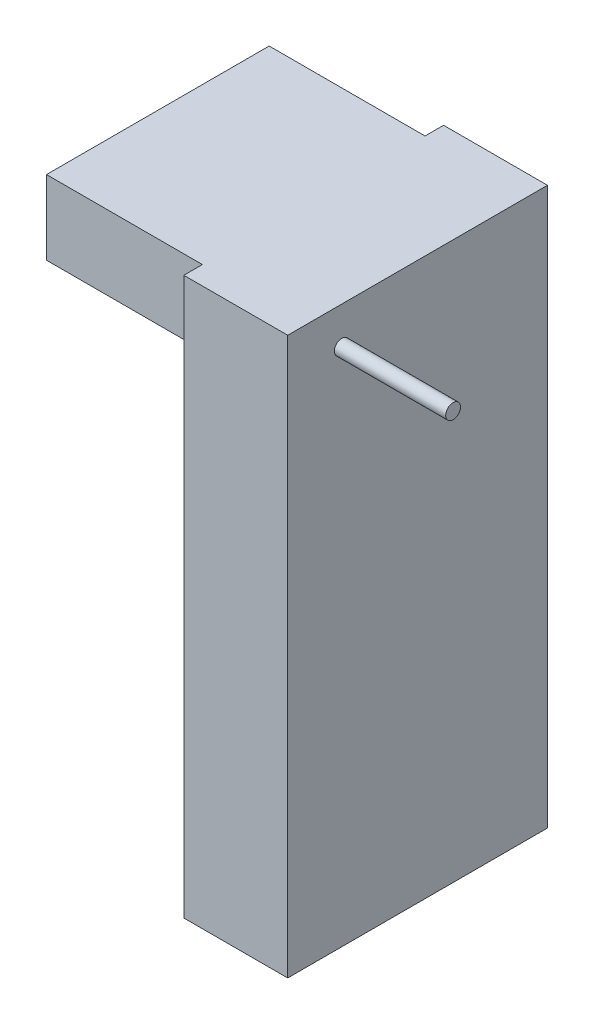
ISO-10303-21;
HEADER;
FILE_DESCRIPTION(('STEP AP214'),'2;1');
FILE_NAME('part.step','',(''),(''),'','','');
FILE_SCHEMA(('AUTOMOTIVE_DESIGN { 1 0 10303 214 1 1 1 1 }'));
ENDSEC;
DATA;
#1=APPLICATION_CONTEXT('core data for automotive mechanical design processes');
#2=APPLICATION_PROTOCOL_DEFINITION('international standard','automotive_design',2000,#1);
#3=PRODUCT_CONTEXT('',#1,'mechanical');
#4=PRODUCT('Part','Part','',(#3));
#5=PRODUCT_RELATED_PRODUCT_CATEGORY('part','',(#4));
#6=PRODUCT_DEFINITION_FORMATION('','',#4);
#7=PRODUCT_DEFINITION_CONTEXT('part definition',#1,'design');
#8=PRODUCT_DEFINITION('design','',#6,#7);
#9=PRODUCT_DEFINITION_SHAPE('','',#8);
#10=(LENGTH_UNIT() NAMED_UNIT(*) SI_UNIT(.MILLI.,.METRE.));
#11=(NAMED_UNIT(*) PLANE_ANGLE_UNIT() SI_UNIT($,.RADIAN.));
#12=(NAMED_UNIT(*) SI_UNIT($,.STERADIAN.) SOLID_ANGLE_UNIT());
#13=UNCERTAINTY_MEASURE_WITH_UNIT(LENGTH_MEASURE(1.E-05),#10,'distance_accuracy_value','');
#14=(GEOMETRIC_REPRESENTATION_CONTEXT(3) GLOBAL_UNCERTAINTY_ASSIGNED_CONTEXT((#13)) GLOBAL_UNIT_ASSIGNED_CONTEXT((#10,
#11,#12)) REPRESENTATION_CONTEXT('',''));
#15=CARTESIAN_POINT('',(0.,0.,0.));
#16=DIRECTION('',(0.,0.,1.));
#17=DIRECTION('',(1.,0.,0.));
#18=AXIS2_PLACEMENT_3D('',#15,#16,#17);
#19=CARTESIAN_POINT('',(35.,3.6035377526542,-8.66832346665717));
#20=DIRECTION('',(0.,0.,-1.));
#21=DIRECTION('',(0.,1.,0.));
#22=AXIS2_PLACEMENT_3D('',#19,#20,#21);
#23=PLANE('',#22);
#24=DIRECTION('',(0.,-1.,0.));
#25=VECTOR('',#24,1.);
#26=CARTESIAN_POINT('',(21.,3.6035377526542,-8.66832346665717));
#27=LINE('',#26,#25);
#28=CARTESIAN_POINT('',(21.,3.6035377526542,-8.66832346665717));
#29=VERTEX_POINT('',#28);
#30=CARTESIAN_POINT('',(21.,-6.3964622473458,-8.66832346665717));
#31=VERTEX_POINT('',#30);
#32=EDGE_CURVE('E144',#29,#31,#27,.T.);
#33=ORIENTED_EDGE('',*,*,#32,.F.);
#34=DIRECTION('',(-1.,0.,0.));
#35=VECTOR('',#34,1.);
#36=CARTESIAN_POINT('',(35.,3.6035377526542,-8.66832346665717));
#37=LINE('',#36,#35);
#38=CARTESIAN_POINT('',(0.,3.6035377526542,-8.66832346665717));
#39=VERTEX_POINT('',#38);
#40=EDGE_CURVE('E46',#29,#39,#37,.T.);
#41=ORIENTED_EDGE('',*,*,#40,.T.);
#42=DIRECTION('',(0.,-1.,0.));
#43=VECTOR('',#42,1.);
#44=CARTESIAN_POINT('',(0.,3.6035377526542,-8.66832346665717));
#45=LINE('',#44,#43);
#46=CARTESIAN_POINT('',(0.,-6.3964622473458,-8.66832346665717));
#47=VERTEX_POINT('',#46);
#48=EDGE_CURVE('E150',#39,#47,#45,.T.);
#49=ORIENTED_EDGE('',*,*,#48,.T.);
#50=DIRECTION('',(-1.,0.,0.));
#51=VECTOR('',#50,1.);
#52=CARTESIAN_POINT('',(35.,-6.3964622473458,-8.66832346665717));
#53=LINE('',#52,#51);
#54=EDGE_CURVE('E11',#31,#47,#53,.T.);
#55=ORIENTED_EDGE('',*,*,#54,.F.);
#56=EDGE_LOOP('',(#33,#41,#49,#55));
#57=FACE_BOUND('',#56,.T.);
#58=ADVANCED_FACE('F32',(#57),#23,.F.);
#59=CARTESIAN_POINT('',(35.,-6.3964622473458,-8.66832346665717));
#60=DIRECTION('',(0.,1.,0.));
#61=DIRECTION('',(0.,0.,1.));
#62=AXIS2_PLACEMENT_3D('',#59,#60,#61);
#63=PLANE('',#62);
#64=DIRECTION('',(0.,0.,-1.));
#65=VECTOR('',#64,1.);
#66=CARTESIAN_POINT('',(21.,-6.3964622473458,-8.66832346665717));
#67=LINE('',#66,#65);
#68=CARTESIAN_POINT('',(21.,-6.3964622473458,-38.6683234666572));
#69=VERTEX_POINT('',#68);
#70=EDGE_CURVE('E142',#31,#69,#67,.T.);
#71=ORIENTED_EDGE('',*,*,#70,.F.);
#72=ORIENTED_EDGE('',*,*,#54,.T.);
#73=DIRECTION('',(0.,0.,-1.));
#74=VECTOR('',#73,1.);
#75=CARTESIAN_POINT('',(0.,-6.3964622473458,-8.66832346665717));
#76=LINE('',#75,#74);
#77=CARTESIAN_POINT('',(0.,-6.3964622473458,-38.6683234666572));
#78=VERTEX_POINT('',#77);
#79=EDGE_CURVE('E157',#47,#78,#76,.T.);
#80=ORIENTED_EDGE('',*,*,#79,.T.);
#81=DIRECTION('',(-1.,0.,0.));
#82=VECTOR('',#81,1.);
#83=CARTESIAN_POINT('',(35.,-6.3964622473458,-38.6683234666572));
#84=LINE('',#83,#82);
#85=EDGE_CURVE('E39',#69,#78,#84,.T.);
#86=ORIENTED_EDGE('',*,*,#85,.F.);
#87=EDGE_LOOP('',(#71,#72,#80,#86));
#88=FACE_BOUND('',#87,.T.);
#89=ADVANCED_FACE('F173',(#88),#63,.F.);
#90=CARTESIAN_POINT('',(35.,3.6035377526542,-38.6683234666572));
#91=DIRECTION('',(0.,0.,1.));
#92=DIRECTION('',(0.,-1.,0.));
#93=AXIS2_PLACEMENT_3D('',#90,#91,#92);
#94=PLANE('',#93);
#95=DIRECTION('',(0.,1.,0.));
#96=VECTOR('',#95,1.);
#97=CARTESIAN_POINT('',(21.,3.6035377526542,-38.6683234666572));
#98=LINE('',#97,#96);
#99=CARTESIAN_POINT('',(21.,3.6035377526542,-38.6683234666572));
#100=VERTEX_POINT('',#99);
#101=EDGE_CURVE('E136',#69,#100,#98,.T.);
#102=ORIENTED_EDGE('',*,*,#101,.F.);
#103=ORIENTED_EDGE('',*,*,#85,.T.);
#104=DIRECTION('',(0.,1.,0.));
#105=VECTOR('',#104,1.);
#106=CARTESIAN_POINT('',(0.,3.6035377526542,-38.6683234666572));
#107=LINE('',#106,#105);
#108=CARTESIAN_POINT('',(0.,3.6035377526542,-38.6683234666572));
#109=VERTEX_POINT('',#108);
#110=EDGE_CURVE('E160',#78,#109,#107,.T.);
#111=ORIENTED_EDGE('',*,*,#110,.T.);
#112=DIRECTION('',(-1.,0.,0.));
#113=VECTOR('',#112,1.);
#114=CARTESIAN_POINT('',(35.,3.6035377526542,-38.6683234666572));
#115=LINE('',#114,#113);
#116=EDGE_CURVE('E53',#100,#109,#115,.T.);
#117=ORIENTED_EDGE('',*,*,#116,.F.);
#118=EDGE_LOOP('',(#102,#103,#111,#117));
#119=FACE_BOUND('',#118,.T.);
#120=ADVANCED_FACE('F167',(#119),#94,.F.);
#121=CARTESIAN_POINT('',(35.,-6.3964622473458,-8.66832346665717));
#122=DIRECTION('',(1.,0.,0.));
#123=DIRECTION('',(0.,0.,-1.));
#124=AXIS2_PLACEMENT_3D('',#121,#122,#123);
#125=PLANE('',#124);
#126=DIRECTION('',(0.,0.,1.));
#127=VECTOR('',#126,1.);
#128=CARTESIAN_POINT('',(35.,3.6035377526542,-8.66832346665717));
#129=LINE('',#128,#127);
#130=CARTESIAN_POINT('',(35.,3.6035377526542,-41.1683234666572));
#131=VERTEX_POINT('',#130);
#132=CARTESIAN_POINT('',(35.,3.6035377526542,-6.16832346665717));
#133=VERTEX_POINT('',#132);
#134=EDGE_CURVE('E153',#131,#133,#129,.T.);
#135=ORIENTED_EDGE('',*,*,#134,.T.);
#136=DIRECTION('',(0.,-1.,0.));
#137=VECTOR('',#136,1.);
#138=CARTESIAN_POINT('',(35.,3.6035377526542,-6.16832346665717));
#139=LINE('',#138,#137);
#140=CARTESIAN_POINT('',(35.,-71.3964622473458,-6.16832346665718));
#141=VERTEX_POINT('',#140);
#142=EDGE_CURVE('E132',#133,#141,#139,.T.);
#143=ORIENTED_EDGE('',*,*,#142,.T.);
#144=DIRECTION('',(0.,0.,-1.));
#145=VECTOR('',#144,1.);
#146=CARTESIAN_POINT('',(35.,-71.3964622473458,-6.16832346665718));
#147=LINE('',#146,#145);
#148=CARTESIAN_POINT('',(35.,-71.3964622473458,-41.1683234666572));
#149=VERTEX_POINT('',#148);
#150=EDGE_CURVE('E103',#141,#149,#147,.T.);
#151=ORIENTED_EDGE('',*,*,#150,.T.);
#152=DIRECTION('',(0.,1.,0.));
#153=VECTOR('',#152,1.);
#154=CARTESIAN_POINT('',(35.,3.6035377526542,-41.1683234666572));
#155=LINE('',#154,#153);
#156=EDGE_CURVE('E124',#149,#131,#155,.T.);
#157=ORIENTED_EDGE('',*,*,#156,.T.);
#158=EDGE_LOOP('',(#135,#143,#151,#157));
#159=FACE_BOUND('',#158,.T.);
#160=CARTESIAN_POINT('',(35.,-1.3964622473458,-13.4502806262695));
#161=DIRECTION('',(1.,0.,0.));
#162=DIRECTION('',(0.,0.,-1.));
#163=AXIS2_PLACEMENT_3D('',#160,#161,#162);
#164=CIRCLE('',#163,1.);
#165=CARTESIAN_POINT('',(35.,-1.3964622473458,-14.4502806262695));
#166=VERTEX_POINT('',#165);
#167=EDGE_CURVE('E146',#166,#166,#164,.T.);
#168=ORIENTED_EDGE('',*,*,#167,.F.);
#169=EDGE_LOOP('',(#168));
#170=FACE_BOUND('',#169,.T.);
#171=ADVANCED_FACE('F186',(#159,#170),#125,.T.);
#172=CARTESIAN_POINT('',(35.,3.6035377526542,-8.66832346665717));
#173=DIRECTION('',(0.,-1.,0.));
#174=DIRECTION('',(0.,0.,-1.));
#175=AXIS2_PLACEMENT_3D('',#172,#173,#174);
#176=PLANE('',#175);
#177=ORIENTED_EDGE('',*,*,#134,.F.);
#178=DIRECTION('',(1.,0.,0.));
#179=VECTOR('',#178,1.);
#180=CARTESIAN_POINT('',(21.,3.6035377526542,-41.1683234666572));
#181=LINE('',#180,#179);
#182=CARTESIAN_POINT('',(21.,3.6035377526542,-41.1683234666572));
#183=VERTEX_POINT('',#182);
#184=EDGE_CURVE('E137',#183,#131,#181,.T.);
#185=ORIENTED_EDGE('',*,*,#184,.F.);
#186=DIRECTION('',(0.,0.,1.));
#187=VECTOR('',#186,1.);
#188=CARTESIAN_POINT('',(21.,3.6035377526542,-6.16832346665717));
#189=LINE('',#188,#187);
#190=EDGE_CURVE('E109',#183,#100,#189,.T.);
#191=ORIENTED_EDGE('',*,*,#190,.T.);
#192=ORIENTED_EDGE('',*,*,#116,.T.);
#193=DIRECTION('',(0.,0.,1.));
#194=VECTOR('',#193,1.);
#195=CARTESIAN_POINT('',(0.,3.6035377526542,-8.66832346665717));
#196=LINE('',#195,#194);
#197=EDGE_CURVE('E155',#109,#39,#196,.T.);
#198=ORIENTED_EDGE('',*,*,#197,.T.);
#199=ORIENTED_EDGE('',*,*,#40,.F.);
#200=CARTESIAN_POINT('',(21.,3.6035377526542,-6.16832346665717));
#201=VERTEX_POINT('',#200);
#202=EDGE_CURVE('E130',#29,#201,#189,.T.);
#203=ORIENTED_EDGE('',*,*,#202,.T.);
#204=DIRECTION('',(1.,0.,0.));
#205=VECTOR('',#204,1.);
#206=CARTESIAN_POINT('',(21.,3.6035377526542,-6.16832346665717));
#207=LINE('',#206,#205);
#208=EDGE_CURVE('E123',#201,#133,#207,.T.);
#209=ORIENTED_EDGE('',*,*,#208,.T.);
#210=EDGE_LOOP('',(#177,#185,#191,#192,#198,#199,#203,#209));
#211=FACE_BOUND('',#210,.T.);
#212=ADVANCED_FACE('F178',(#211),#176,.F.);
#213=CARTESIAN_POINT('',(0.,-6.3964622473458,-8.66832346665717));
#214=DIRECTION('',(1.,0.,0.));
#215=DIRECTION('',(0.,0.,-1.));
#216=AXIS2_PLACEMENT_3D('',#213,#214,#215);
#217=PLANE('',#216);
#218=ORIENTED_EDGE('',*,*,#48,.F.);
#219=ORIENTED_EDGE('',*,*,#197,.F.);
#220=ORIENTED_EDGE('',*,*,#110,.F.);
#221=ORIENTED_EDGE('',*,*,#79,.F.);
#222=EDGE_LOOP('',(#218,#219,#220,#221));
#223=FACE_BOUND('',#222,.T.);
#224=ADVANCED_FACE('F177',(#223),#217,.F.);
#225=CARTESIAN_POINT('',(50.,-1.3964622473458,-13.4502806262695));
#226=DIRECTION('',(-1.,0.,0.));
#227=DIRECTION('',(0.,0.,1.));
#228=AXIS2_PLACEMENT_3D('',#225,#226,#227);
#229=CYLINDRICAL_SURFACE('',#228,1.);
#230=CARTESIAN_POINT('',(50.,-1.3964622473458,-13.4502806262695));
#231=DIRECTION('',(1.,0.,0.));
#232=DIRECTION('',(0.,0.,-1.));
#233=AXIS2_PLACEMENT_3D('',#230,#231,#232);
#234=CIRCLE('',#233,1.);
#235=CARTESIAN_POINT('',(50.,-1.3964622473458,-14.4502806262695));
#236=VERTEX_POINT('',#235);
#237=EDGE_CURVE('E147',#236,#236,#234,.T.);
#238=ORIENTED_EDGE('',*,*,#237,.F.);
#239=EDGE_LOOP('',(#238));
#240=FACE_BOUND('',#239,.T.);
#241=ORIENTED_EDGE('',*,*,#167,.T.);
#242=EDGE_LOOP('',(#241));
#243=FACE_BOUND('',#242,.T.);
#244=ADVANCED_FACE('F193',(#240,#243),#229,.T.);
#245=CARTESIAN_POINT('',(50.,-1.3964622473458,-13.4502806262695));
#246=DIRECTION('',(1.,0.,0.));
#247=DIRECTION('',(0.,0.,-1.));
#248=AXIS2_PLACEMENT_3D('',#245,#246,#247);
#249=PLANE('',#248);
#250=ORIENTED_EDGE('',*,*,#237,.T.);
#251=EDGE_LOOP('',(#250));
#252=FACE_BOUND('',#251,.T.);
#253=ADVANCED_FACE('F199',(#252),#249,.T.);
#254=CARTESIAN_POINT('',(21.,-71.3964622473458,-6.16832346665718));
#255=DIRECTION('',(1.,0.,0.));
#256=DIRECTION('',(0.,0.,-1.));
#257=AXIS2_PLACEMENT_3D('',#254,#255,#256);
#258=PLANE('',#257);
#259=ORIENTED_EDGE('',*,*,#202,.F.);
#260=ORIENTED_EDGE('',*,*,#32,.T.);
#261=ORIENTED_EDGE('',*,*,#70,.T.);
#262=ORIENTED_EDGE('',*,*,#101,.T.);
#263=ORIENTED_EDGE('',*,*,#190,.F.);
#264=DIRECTION('',(0.,1.,0.));
#265=VECTOR('',#264,1.);
#266=CARTESIAN_POINT('',(21.,3.6035377526542,-41.1683234666572));
#267=LINE('',#266,#265);
#268=CARTESIAN_POINT('',(21.,-71.3964622473458,-41.1683234666572));
#269=VERTEX_POINT('',#268);
#270=EDGE_CURVE('E118',#269,#183,#267,.T.);
#271=ORIENTED_EDGE('',*,*,#270,.F.);
#272=DIRECTION('',(0.,0.,-1.));
#273=VECTOR('',#272,1.);
#274=CARTESIAN_POINT('',(21.,-71.3964622473458,-6.16832346665718));
#275=LINE('',#274,#273);
#276=CARTESIAN_POINT('',(21.,-71.3964622473458,-6.16832346665718));
#277=VERTEX_POINT('',#276);
#278=EDGE_CURVE('E101',#277,#269,#275,.T.);
#279=ORIENTED_EDGE('',*,*,#278,.F.);
#280=DIRECTION('',(0.,-1.,0.));
#281=VECTOR('',#280,1.);
#282=CARTESIAN_POINT('',(21.,3.6035377526542,-6.16832346665717));
#283=LINE('',#282,#281);
#284=EDGE_CURVE('E115',#201,#277,#283,.T.);
#285=ORIENTED_EDGE('',*,*,#284,.F.);
#286=EDGE_LOOP('',(#259,#260,#261,#262,#263,#271,#279,#285));
#287=FACE_BOUND('',#286,.T.);
#288=ADVANCED_FACE('F114',(#287),#258,.F.);
#289=CARTESIAN_POINT('',(21.,3.6035377526542,-6.16832346665717));
#290=DIRECTION('',(0.,0.,1.));
#291=DIRECTION('',(0.,-1.,0.));
#292=AXIS2_PLACEMENT_3D('',#289,#290,#291);
#293=PLANE('',#292);
#294=ORIENTED_EDGE('',*,*,#142,.F.);
#295=ORIENTED_EDGE('',*,*,#208,.F.);
#296=ORIENTED_EDGE('',*,*,#284,.T.);
#297=DIRECTION('',(1.,0.,0.));
#298=VECTOR('',#297,1.);
#299=CARTESIAN_POINT('',(21.,-71.3964622473458,-6.16832346665718));
#300=LINE('',#299,#298);
#301=EDGE_CURVE('E98',#277,#141,#300,.T.);
#302=ORIENTED_EDGE('',*,*,#301,.T.);
#303=EDGE_LOOP('',(#294,#295,#296,#302));
#304=FACE_BOUND('',#303,.T.);
#305=ADVANCED_FACE('F121',(#304),#293,.T.);
#306=CARTESIAN_POINT('',(21.,3.6035377526542,-41.1683234666572));
#307=DIRECTION('',(0.,0.,-1.));
#308=DIRECTION('',(0.,1.,0.));
#309=AXIS2_PLACEMENT_3D('',#306,#307,#308);
#310=PLANE('',#309);
#311=ORIENTED_EDGE('',*,*,#156,.F.);
#312=DIRECTION('',(1.,0.,0.));
#313=VECTOR('',#312,1.);
#314=CARTESIAN_POINT('',(21.,-71.3964622473458,-41.1683234666572));
#315=LINE('',#314,#313);
#316=EDGE_CURVE('E108',#269,#149,#315,.T.);
#317=ORIENTED_EDGE('',*,*,#316,.F.);
#318=ORIENTED_EDGE('',*,*,#270,.T.);
#319=ORIENTED_EDGE('',*,*,#184,.T.);
#320=EDGE_LOOP('',(#311,#317,#318,#319));
#321=FACE_BOUND('',#320,.T.);
#322=ADVANCED_FACE('F206',(#321),#310,.T.);
#323=CARTESIAN_POINT('',(21.,-71.3964622473458,-6.16832346665718));
#324=DIRECTION('',(0.,-1.,0.));
#325=DIRECTION('',(0.,0.,-1.));
#326=AXIS2_PLACEMENT_3D('',#323,#324,#325);
#327=PLANE('',#326);
#328=ORIENTED_EDGE('',*,*,#150,.F.);
#329=ORIENTED_EDGE('',*,*,#301,.F.);
#330=ORIENTED_EDGE('',*,*,#278,.T.);
#331=ORIENTED_EDGE('',*,*,#316,.T.);
#332=EDGE_LOOP('',(#328,#329,#330,#331));
#333=FACE_BOUND('',#332,.T.);
#334=ADVANCED_FACE('F100',(#333),#327,.T.);
#335=CLOSED_SHELL('',(#58,#89,#120,#171,#212,#224,#244,#253,#288,#305,#322,#334));
#336=MANIFOLD_SOLID_BREP('B2',#335);
#337=ADVANCED_BREP_SHAPE_REPRESENTATION('',(#18,#336),#14);
#338=SHAPE_DEFINITION_REPRESENTATION(#9,#337);
ENDSEC;
END-ISO-10303-21;
